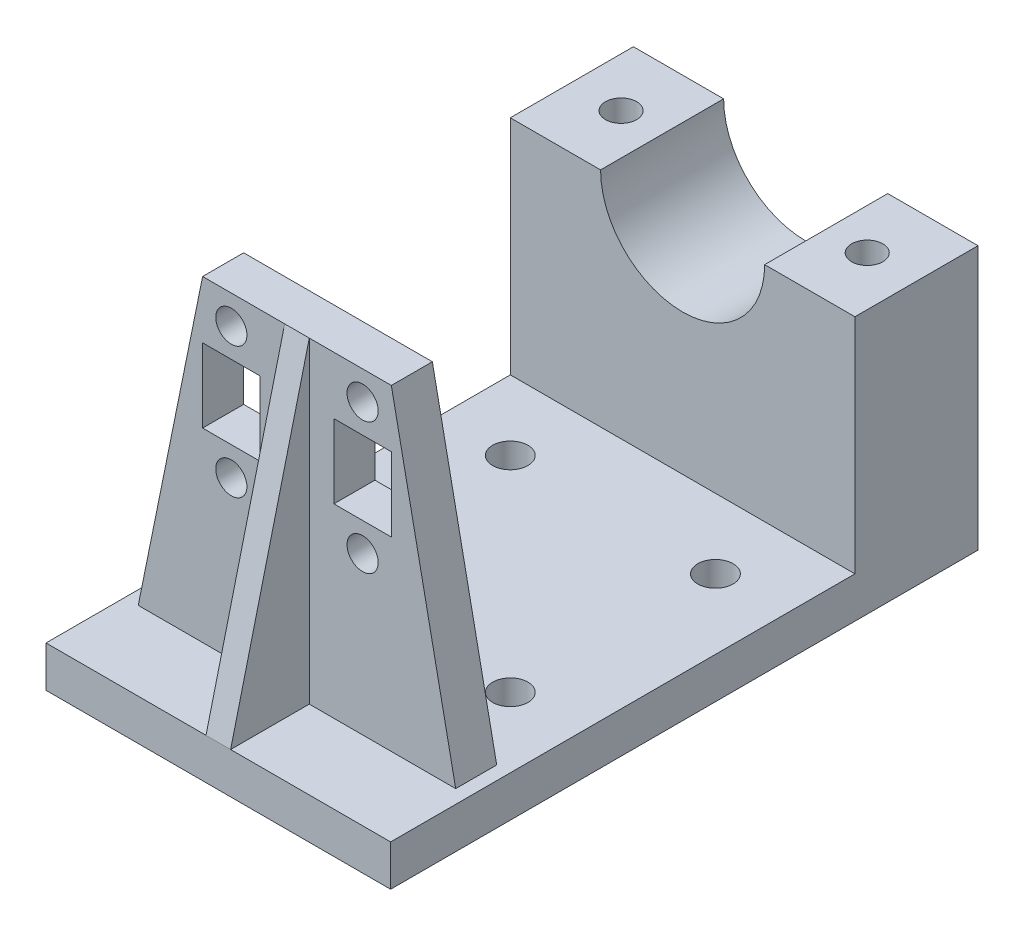
ISO-10303-21;
HEADER;
FILE_DESCRIPTION(('STEP AP214'),'2;1');
FILE_NAME('part.step','',(''),(''),'','','');
FILE_SCHEMA(('AUTOMOTIVE_DESIGN { 1 0 10303 214 1 1 1 1 }'));
ENDSEC;
DATA;
#1=APPLICATION_CONTEXT('core data for automotive mechanical design processes');
#2=APPLICATION_PROTOCOL_DEFINITION('international standard','automotive_design',2000,#1);
#3=PRODUCT_CONTEXT('',#1,'mechanical');
#4=PRODUCT('Part','Part','',(#3));
#5=PRODUCT_RELATED_PRODUCT_CATEGORY('part','',(#4));
#6=PRODUCT_DEFINITION_FORMATION('','',#4);
#7=PRODUCT_DEFINITION_CONTEXT('part definition',#1,'design');
#8=PRODUCT_DEFINITION('design','',#6,#7);
#9=PRODUCT_DEFINITION_SHAPE('','',#8);
#10=(LENGTH_UNIT() NAMED_UNIT(*) SI_UNIT(.MILLI.,.METRE.));
#11=(NAMED_UNIT(*) PLANE_ANGLE_UNIT() SI_UNIT($,.RADIAN.));
#12=(NAMED_UNIT(*) SI_UNIT($,.STERADIAN.) SOLID_ANGLE_UNIT());
#13=UNCERTAINTY_MEASURE_WITH_UNIT(LENGTH_MEASURE(1.E-05),#10,'distance_accuracy_value','');
#14=(GEOMETRIC_REPRESENTATION_CONTEXT(3) GLOBAL_UNCERTAINTY_ASSIGNED_CONTEXT((#13)) GLOBAL_UNIT_ASSIGNED_CONTEXT((#10,
#11,#12)) REPRESENTATION_CONTEXT('',''));
#15=CARTESIAN_POINT('',(0.,0.,0.));
#16=DIRECTION('',(0.,0.,1.));
#17=DIRECTION('',(1.,0.,0.));
#18=AXIS2_PLACEMENT_3D('',#15,#16,#17);
#19=CARTESIAN_POINT('',(-8.,-8.,54.5));
#20=DIRECTION('',(0.,0.,-1.));
#21=DIRECTION('',(-1.,0.,0.));
#22=AXIS2_PLACEMENT_3D('',#19,#20,#21);
#23=CYLINDRICAL_SURFACE('',#22,1.9);
#24=CARTESIAN_POINT('',(-8.,-8.,54.5));
#25=DIRECTION('',(0.,0.,1.));
#26=DIRECTION('',(1.,0.,0.));
#27=AXIS2_PLACEMENT_3D('',#24,#25,#26);
#28=CIRCLE('',#27,1.9);
#29=CARTESIAN_POINT('',(-6.1,-8.,54.5));
#30=VERTEX_POINT('',#29);
#31=EDGE_CURVE('E312',#30,#30,#28,.T.);
#32=ORIENTED_EDGE('',*,*,#31,.T.);
#33=EDGE_LOOP('',(#32));
#34=FACE_BOUND('',#33,.T.);
#35=CARTESIAN_POINT('',(-8.,-8.,49.5));
#36=DIRECTION('',(0.,0.,1.));
#37=DIRECTION('',(1.,0.,0.));
#38=AXIS2_PLACEMENT_3D('',#35,#36,#37);
#39=CIRCLE('',#38,1.9);
#40=CARTESIAN_POINT('',(-6.1,-8.,49.5));
#41=VERTEX_POINT('',#40);
#42=EDGE_CURVE('E316',#41,#41,#39,.T.);
#43=ORIENTED_EDGE('',*,*,#42,.F.);
#44=EDGE_LOOP('',(#43));
#45=FACE_BOUND('',#44,.T.);
#46=ADVANCED_FACE('F40',(#34,#45),#23,.F.);
#47=CARTESIAN_POINT('',(-8.,8.,54.5));
#48=DIRECTION('',(0.,0.,-1.));
#49=DIRECTION('',(-1.,0.,0.));
#50=AXIS2_PLACEMENT_3D('',#47,#48,#49);
#51=CYLINDRICAL_SURFACE('',#50,1.9);
#52=CARTESIAN_POINT('',(-8.,8.,54.5));
#53=DIRECTION('',(0.,0.,1.));
#54=DIRECTION('',(1.,0.,0.));
#55=AXIS2_PLACEMENT_3D('',#52,#53,#54);
#56=CIRCLE('',#55,1.9);
#57=CARTESIAN_POINT('',(-6.1,8.,54.5));
#58=VERTEX_POINT('',#57);
#59=EDGE_CURVE('E289',#58,#58,#56,.T.);
#60=ORIENTED_EDGE('',*,*,#59,.T.);
#61=EDGE_LOOP('',(#60));
#62=FACE_BOUND('',#61,.T.);
#63=CARTESIAN_POINT('',(-8.,8.,49.5));
#64=DIRECTION('',(0.,0.,1.));
#65=DIRECTION('',(1.,0.,0.));
#66=AXIS2_PLACEMENT_3D('',#63,#64,#65);
#67=CIRCLE('',#66,1.9);
#68=CARTESIAN_POINT('',(-6.1,8.,49.5));
#69=VERTEX_POINT('',#68);
#70=EDGE_CURVE('E300',#69,#69,#67,.T.);
#71=ORIENTED_EDGE('',*,*,#70,.F.);
#72=EDGE_LOOP('',(#71));
#73=FACE_BOUND('',#72,.T.);
#74=ADVANCED_FACE('F548',(#62,#73),#51,.F.);
#75=CARTESIAN_POINT('',(8.,8.,54.5));
#76=DIRECTION('',(0.,0.,-1.));
#77=DIRECTION('',(-1.,0.,0.));
#78=AXIS2_PLACEMENT_3D('',#75,#76,#77);
#79=CYLINDRICAL_SURFACE('',#78,1.9);
#80=CARTESIAN_POINT('',(8.,8.,54.5));
#81=DIRECTION('',(0.,0.,1.));
#82=DIRECTION('',(1.,0.,0.));
#83=AXIS2_PLACEMENT_3D('',#80,#81,#82);
#84=CIRCLE('',#83,1.9);
#85=CARTESIAN_POINT('',(9.9,8.,54.5));
#86=VERTEX_POINT('',#85);
#87=EDGE_CURVE('E304',#86,#86,#84,.T.);
#88=ORIENTED_EDGE('',*,*,#87,.T.);
#89=EDGE_LOOP('',(#88));
#90=FACE_BOUND('',#89,.T.);
#91=CARTESIAN_POINT('',(8.,8.,49.5));
#92=DIRECTION('',(0.,0.,1.));
#93=DIRECTION('',(1.,0.,0.));
#94=AXIS2_PLACEMENT_3D('',#91,#92,#93);
#95=CIRCLE('',#94,1.9);
#96=CARTESIAN_POINT('',(9.9,8.,49.5));
#97=VERTEX_POINT('',#96);
#98=EDGE_CURVE('E308',#97,#97,#95,.T.);
#99=ORIENTED_EDGE('',*,*,#98,.F.);
#100=EDGE_LOOP('',(#99));
#101=FACE_BOUND('',#100,.T.);
#102=ADVANCED_FACE('F554',(#90,#101),#79,.F.);
#103=CARTESIAN_POINT('',(8.,-8.,54.5));
#104=DIRECTION('',(0.,0.,-1.));
#105=DIRECTION('',(-1.,0.,0.));
#106=AXIS2_PLACEMENT_3D('',#103,#104,#105);
#107=CYLINDRICAL_SURFACE('',#106,1.9);
#108=CARTESIAN_POINT('',(8.,-8.,54.5));
#109=DIRECTION('',(0.,0.,1.));
#110=DIRECTION('',(1.,0.,0.));
#111=AXIS2_PLACEMENT_3D('',#108,#109,#110);
#112=CIRCLE('',#111,1.9);
#113=CARTESIAN_POINT('',(9.9,-8.,54.5));
#114=VERTEX_POINT('',#113);
#115=EDGE_CURVE('E320',#114,#114,#112,.T.);
#116=ORIENTED_EDGE('',*,*,#115,.T.);
#117=EDGE_LOOP('',(#116));
#118=FACE_BOUND('',#117,.T.);
#119=CARTESIAN_POINT('',(8.,-8.,49.5));
#120=DIRECTION('',(0.,0.,1.));
#121=DIRECTION('',(1.,0.,0.));
#122=AXIS2_PLACEMENT_3D('',#119,#120,#121);
#123=CIRCLE('',#122,1.9);
#124=CARTESIAN_POINT('',(9.9,-8.,49.5));
#125=VERTEX_POINT('',#124);
#126=EDGE_CURVE('E324',#125,#125,#123,.T.);
#127=ORIENTED_EDGE('',*,*,#126,.F.);
#128=EDGE_LOOP('',(#127));
#129=FACE_BOUND('',#128,.T.);
#130=ADVANCED_FACE('F560',(#118,#129),#107,.F.);
#131=CARTESIAN_POINT('',(-11.5,4.5,54.5));
#132=DIRECTION('',(1.,0.,0.));
#133=DIRECTION('',(0.,0.,-1.));
#134=AXIS2_PLACEMENT_3D('',#131,#132,#133);
#135=PLANE('',#134);
#136=DIRECTION('',(0.,-1.,0.));
#137=VECTOR('',#136,1.);
#138=CARTESIAN_POINT('',(-11.5,4.5,49.5));
#139=LINE('',#138,#137);
#140=CARTESIAN_POINT('',(-11.5,4.5,49.5));
#141=VERTEX_POINT('',#140);
#142=CARTESIAN_POINT('',(-11.5,-4.5,49.5));
#143=VERTEX_POINT('',#142);
#144=EDGE_CURVE('E351',#141,#143,#139,.T.);
#145=ORIENTED_EDGE('',*,*,#144,.F.);
#146=DIRECTION('',(0.,0.,-1.));
#147=VECTOR('',#146,1.);
#148=CARTESIAN_POINT('',(-11.5,4.5,54.5));
#149=LINE('',#148,#147);
#150=CARTESIAN_POINT('',(-11.5,4.5,54.5));
#151=VERTEX_POINT('',#150);
#152=EDGE_CURVE('E335',#151,#141,#149,.T.);
#153=ORIENTED_EDGE('',*,*,#152,.F.);
#154=DIRECTION('',(0.,-1.,0.));
#155=VECTOR('',#154,1.);
#156=CARTESIAN_POINT('',(-11.5,4.5,54.5));
#157=LINE('',#156,#155);
#158=CARTESIAN_POINT('',(-11.5,-4.5,54.5));
#159=VERTEX_POINT('',#158);
#160=EDGE_CURVE('E366',#151,#159,#157,.T.);
#161=ORIENTED_EDGE('',*,*,#160,.T.);
#162=DIRECTION('',(0.,0.,-1.));
#163=VECTOR('',#162,1.);
#164=CARTESIAN_POINT('',(-11.5,-4.5,54.5));
#165=LINE('',#164,#163);
#166=EDGE_CURVE('E338',#159,#143,#165,.T.);
#167=ORIENTED_EDGE('',*,*,#166,.T.);
#168=EDGE_LOOP('',(#145,#153,#161,#167));
#169=FACE_BOUND('',#168,.T.);
#170=ADVANCED_FACE('F636',(#169),#135,.T.);
#171=CARTESIAN_POINT('',(-11.5,4.5,54.5));
#172=DIRECTION('',(0.,-1.,0.));
#173=DIRECTION('',(0.,0.,-1.));
#174=AXIS2_PLACEMENT_3D('',#171,#172,#173);
#175=PLANE('',#174);
#176=DIRECTION('',(-1.,0.,0.));
#177=VECTOR('',#176,1.);
#178=CARTESIAN_POINT('',(-11.5,4.5,49.5));
#179=LINE('',#178,#177);
#180=CARTESIAN_POINT('',(-4.5,4.5,49.5));
#181=VERTEX_POINT('',#180);
#182=EDGE_CURVE('E355',#181,#141,#179,.T.);
#183=ORIENTED_EDGE('',*,*,#182,.F.);
#184=DIRECTION('',(0.,0.,-1.));
#185=VECTOR('',#184,1.);
#186=CARTESIAN_POINT('',(-4.5,4.5,54.5));
#187=LINE('',#186,#185);
#188=CARTESIAN_POINT('',(-4.5,4.5,54.5));
#189=VERTEX_POINT('',#188);
#190=EDGE_CURVE('E328',#189,#181,#187,.T.);
#191=ORIENTED_EDGE('',*,*,#190,.F.);
#192=DIRECTION('',(-1.,0.,0.));
#193=VECTOR('',#192,1.);
#194=CARTESIAN_POINT('',(-11.5,4.5,54.5));
#195=LINE('',#194,#193);
#196=EDGE_CURVE('E370',#189,#151,#195,.T.);
#197=ORIENTED_EDGE('',*,*,#196,.T.);
#198=ORIENTED_EDGE('',*,*,#152,.T.);
#199=EDGE_LOOP('',(#183,#191,#197,#198));
#200=FACE_BOUND('',#199,.T.);
#201=ADVANCED_FACE('F639',(#200),#175,.T.);
#202=CARTESIAN_POINT('',(-4.5,4.5,54.5));
#203=DIRECTION('',(-1.,0.,0.));
#204=DIRECTION('',(0.,0.,1.));
#205=AXIS2_PLACEMENT_3D('',#202,#203,#204);
#206=PLANE('',#205);
#207=DIRECTION('',(0.,1.,0.));
#208=VECTOR('',#207,1.);
#209=CARTESIAN_POINT('',(-4.5,4.5,49.5));
#210=LINE('',#209,#208);
#211=CARTESIAN_POINT('',(-4.5,-4.5,49.5));
#212=VERTEX_POINT('',#211);
#213=EDGE_CURVE('E359',#212,#181,#210,.T.);
#214=ORIENTED_EDGE('',*,*,#213,.F.);
#215=DIRECTION('',(0.,0.,-1.));
#216=VECTOR('',#215,1.);
#217=CARTESIAN_POINT('',(-4.5,-4.5,54.5));
#218=LINE('',#217,#216);
#219=CARTESIAN_POINT('',(-4.5,-4.5,54.5));
#220=VERTEX_POINT('',#219);
#221=EDGE_CURVE('E341',#220,#212,#218,.T.);
#222=ORIENTED_EDGE('',*,*,#221,.F.);
#223=DIRECTION('',(0.,1.,0.));
#224=VECTOR('',#223,1.);
#225=CARTESIAN_POINT('',(-4.5,4.5,54.5));
#226=LINE('',#225,#224);
#227=EDGE_CURVE('E350',#220,#189,#226,.T.);
#228=ORIENTED_EDGE('',*,*,#227,.T.);
#229=ORIENTED_EDGE('',*,*,#190,.T.);
#230=EDGE_LOOP('',(#214,#222,#228,#229));
#231=FACE_BOUND('',#230,.T.);
#232=ADVANCED_FACE('F634',(#231),#206,.T.);
#233=CARTESIAN_POINT('',(-11.5,-4.5,54.5));
#234=DIRECTION('',(0.,1.,0.));
#235=DIRECTION('',(0.,0.,1.));
#236=AXIS2_PLACEMENT_3D('',#233,#234,#235);
#237=PLANE('',#236);
#238=DIRECTION('',(1.,0.,0.));
#239=VECTOR('',#238,1.);
#240=CARTESIAN_POINT('',(-11.5,-4.5,49.5));
#241=LINE('',#240,#239);
#242=EDGE_CURVE('E346',#143,#212,#241,.T.);
#243=ORIENTED_EDGE('',*,*,#242,.F.);
#244=ORIENTED_EDGE('',*,*,#166,.F.);
#245=DIRECTION('',(1.,0.,0.));
#246=VECTOR('',#245,1.);
#247=CARTESIAN_POINT('',(-11.5,-4.5,54.5));
#248=LINE('',#247,#246);
#249=EDGE_CURVE('E345',#159,#220,#248,.T.);
#250=ORIENTED_EDGE('',*,*,#249,.T.);
#251=ORIENTED_EDGE('',*,*,#221,.T.);
#252=EDGE_LOOP('',(#243,#244,#250,#251));
#253=FACE_BOUND('',#252,.T.);
#254=ADVANCED_FACE('F624',(#253),#237,.T.);
#255=CARTESIAN_POINT('',(4.5,4.5,54.5));
#256=DIRECTION('',(1.,0.,0.));
#257=DIRECTION('',(0.,0.,-1.));
#258=AXIS2_PLACEMENT_3D('',#255,#256,#257);
#259=PLANE('',#258);
#260=DIRECTION('',(0.,-1.,0.));
#261=VECTOR('',#260,1.);
#262=CARTESIAN_POINT('',(4.5,4.5,49.5));
#263=LINE('',#262,#261);
#264=CARTESIAN_POINT('',(4.5,4.5,49.5));
#265=VERTEX_POINT('',#264);
#266=CARTESIAN_POINT('',(4.5,-4.5,49.5));
#267=VERTEX_POINT('',#266);
#268=EDGE_CURVE('E393',#265,#267,#263,.T.);
#269=ORIENTED_EDGE('',*,*,#268,.F.);
#270=DIRECTION('',(0.,0.,-1.));
#271=VECTOR('',#270,1.);
#272=CARTESIAN_POINT('',(4.5,4.5,54.5));
#273=LINE('',#272,#271);
#274=CARTESIAN_POINT('',(4.5,4.5,54.5));
#275=VERTEX_POINT('',#274);
#276=EDGE_CURVE('E378',#275,#265,#273,.T.);
#277=ORIENTED_EDGE('',*,*,#276,.F.);
#278=DIRECTION('',(0.,-1.,0.));
#279=VECTOR('',#278,1.);
#280=CARTESIAN_POINT('',(4.5,4.5,54.5));
#281=LINE('',#280,#279);
#282=CARTESIAN_POINT('',(4.5,-4.5,54.5));
#283=VERTEX_POINT('',#282);
#284=EDGE_CURVE('E408',#275,#283,#281,.T.);
#285=ORIENTED_EDGE('',*,*,#284,.T.);
#286=DIRECTION('',(0.,0.,-1.));
#287=VECTOR('',#286,1.);
#288=CARTESIAN_POINT('',(4.5,-4.5,54.5));
#289=LINE('',#288,#287);
#290=EDGE_CURVE('E66',#283,#267,#289,.T.);
#291=ORIENTED_EDGE('',*,*,#290,.T.);
#292=EDGE_LOOP('',(#269,#277,#285,#291));
#293=FACE_BOUND('',#292,.T.);
#294=ADVANCED_FACE('F620',(#293),#259,.T.);
#295=CARTESIAN_POINT('',(4.5,4.5,54.5));
#296=DIRECTION('',(0.,-1.,0.));
#297=DIRECTION('',(0.,0.,-1.));
#298=AXIS2_PLACEMENT_3D('',#295,#296,#297);
#299=PLANE('',#298);
#300=DIRECTION('',(-1.,0.,0.));
#301=VECTOR('',#300,1.);
#302=CARTESIAN_POINT('',(4.5,4.5,49.5));
#303=LINE('',#302,#301);
#304=CARTESIAN_POINT('',(11.5,4.5,49.5));
#305=VERTEX_POINT('',#304);
#306=EDGE_CURVE('E397',#305,#265,#303,.T.);
#307=ORIENTED_EDGE('',*,*,#306,.F.);
#308=DIRECTION('',(0.,0.,-1.));
#309=VECTOR('',#308,1.);
#310=CARTESIAN_POINT('',(11.5,4.5,54.5));
#311=LINE('',#310,#309);
#312=CARTESIAN_POINT('',(11.5,4.5,54.5));
#313=VERTEX_POINT('',#312);
#314=EDGE_CURVE('E363',#313,#305,#311,.T.);
#315=ORIENTED_EDGE('',*,*,#314,.F.);
#316=DIRECTION('',(-1.,0.,0.));
#317=VECTOR('',#316,1.);
#318=CARTESIAN_POINT('',(4.5,4.5,54.5));
#319=LINE('',#318,#317);
#320=EDGE_CURVE('E411',#313,#275,#319,.T.);
#321=ORIENTED_EDGE('',*,*,#320,.T.);
#322=ORIENTED_EDGE('',*,*,#276,.T.);
#323=EDGE_LOOP('',(#307,#315,#321,#322));
#324=FACE_BOUND('',#323,.T.);
#325=ADVANCED_FACE('F623',(#324),#299,.T.);
#326=CARTESIAN_POINT('',(11.5,4.5,54.5));
#327=DIRECTION('',(-1.,0.,0.));
#328=DIRECTION('',(0.,0.,1.));
#329=AXIS2_PLACEMENT_3D('',#326,#327,#328);
#330=PLANE('',#329);
#331=DIRECTION('',(0.,1.,0.));
#332=VECTOR('',#331,1.);
#333=CARTESIAN_POINT('',(11.5,4.5,49.5));
#334=LINE('',#333,#332);
#335=CARTESIAN_POINT('',(11.5,-4.5,49.5));
#336=VERTEX_POINT('',#335);
#337=EDGE_CURVE('E401',#336,#305,#334,.T.);
#338=ORIENTED_EDGE('',*,*,#337,.F.);
#339=DIRECTION('',(0.,0.,-1.));
#340=VECTOR('',#339,1.);
#341=CARTESIAN_POINT('',(11.5,-4.5,54.5));
#342=LINE('',#341,#340);
#343=CARTESIAN_POINT('',(11.5,-4.5,54.5));
#344=VERTEX_POINT('',#343);
#345=EDGE_CURVE('E383',#344,#336,#342,.T.);
#346=ORIENTED_EDGE('',*,*,#345,.F.);
#347=DIRECTION('',(0.,1.,0.));
#348=VECTOR('',#347,1.);
#349=CARTESIAN_POINT('',(11.5,4.5,54.5));
#350=LINE('',#349,#348);
#351=EDGE_CURVE('E392',#344,#313,#350,.T.);
#352=ORIENTED_EDGE('',*,*,#351,.T.);
#353=ORIENTED_EDGE('',*,*,#314,.T.);
#354=EDGE_LOOP('',(#338,#346,#352,#353));
#355=FACE_BOUND('',#354,.T.);
#356=ADVANCED_FACE('F584',(#355),#330,.T.);
#357=CARTESIAN_POINT('',(4.5,-4.5,54.5));
#358=DIRECTION('',(0.,1.,0.));
#359=DIRECTION('',(0.,0.,1.));
#360=AXIS2_PLACEMENT_3D('',#357,#358,#359);
#361=PLANE('',#360);
#362=DIRECTION('',(1.,0.,0.));
#363=VECTOR('',#362,1.);
#364=CARTESIAN_POINT('',(4.5,-4.5,49.5));
#365=LINE('',#364,#363);
#366=EDGE_CURVE('E388',#267,#336,#365,.T.);
#367=ORIENTED_EDGE('',*,*,#366,.F.);
#368=ORIENTED_EDGE('',*,*,#290,.F.);
#369=DIRECTION('',(1.,0.,0.));
#370=VECTOR('',#369,1.);
#371=CARTESIAN_POINT('',(4.5,-4.5,54.5));
#372=LINE('',#371,#370);
#373=EDGE_CURVE('E387',#283,#344,#372,.T.);
#374=ORIENTED_EDGE('',*,*,#373,.T.);
#375=ORIENTED_EDGE('',*,*,#345,.T.);
#376=EDGE_LOOP('',(#367,#368,#374,#375));
#377=FACE_BOUND('',#376,.T.);
#378=ADVANCED_FACE('F579',(#377),#361,.T.);
#379=CARTESIAN_POINT('',(-11.5,11.5,54.5));
#380=DIRECTION('',(0.,-1.,0.));
#381=DIRECTION('',(0.,0.,-1.));
#382=AXIS2_PLACEMENT_3D('',#379,#380,#381);
#383=PLANE('',#382);
#384=DIRECTION('',(-1.,0.,0.));
#385=VECTOR('',#384,1.);
#386=CARTESIAN_POINT('',(-11.5,11.5,49.5));
#387=LINE('',#386,#385);
#388=CARTESIAN_POINT('',(11.5,11.5,49.5));
#389=VERTEX_POINT('',#388);
#390=CARTESIAN_POINT('',(-11.5,11.5,49.5));
#391=VERTEX_POINT('',#390);
#392=EDGE_CURVE('E283',#389,#391,#387,.T.);
#393=ORIENTED_EDGE('',*,*,#392,.T.);
#394=DIRECTION('',(0.,0.,-1.));
#395=VECTOR('',#394,1.);
#396=CARTESIAN_POINT('',(-11.5,11.5,54.5));
#397=LINE('',#396,#395);
#398=CARTESIAN_POINT('',(-11.5,11.5,54.5));
#399=VERTEX_POINT('',#398);
#400=EDGE_CURVE('E273',#399,#391,#397,.T.);
#401=ORIENTED_EDGE('',*,*,#400,.F.);
#402=DIRECTION('',(-1.,0.,0.));
#403=VECTOR('',#402,1.);
#404=CARTESIAN_POINT('',(-11.5,11.5,54.5));
#405=LINE('',#404,#403);
#406=CARTESIAN_POINT('',(-1.5,11.5,54.5));
#407=VERTEX_POINT('',#406);
#408=EDGE_CURVE('E297',#407,#399,#405,.T.);
#409=ORIENTED_EDGE('',*,*,#408,.F.);
#410=DIRECTION('',(-1.,0.,0.));
#411=VECTOR('',#410,1.);
#412=CARTESIAN_POINT('',(1.5,11.5,54.5));
#413=LINE('',#412,#411);
#414=CARTESIAN_POINT('',(1.5,11.5,54.5));
#415=VERTEX_POINT('',#414);
#416=EDGE_CURVE('E405',#415,#407,#413,.T.);
#417=ORIENTED_EDGE('',*,*,#416,.F.);
#418=CARTESIAN_POINT('',(11.5,11.5,54.5));
#419=VERTEX_POINT('',#418);
#420=EDGE_CURVE('E293',#419,#415,#405,.T.);
#421=ORIENTED_EDGE('',*,*,#420,.F.);
#422=DIRECTION('',(0.,0.,-1.));
#423=VECTOR('',#422,1.);
#424=CARTESIAN_POINT('',(11.5,11.5,54.5));
#425=LINE('',#424,#423);
#426=EDGE_CURVE('E50',#419,#389,#425,.T.);
#427=ORIENTED_EDGE('',*,*,#426,.T.);
#428=EDGE_LOOP('',(#393,#401,#409,#417,#421,#427));
#429=FACE_BOUND('',#428,.T.);
#430=ADVANCED_FACE('F576',(#429),#383,.F.);
#431=CARTESIAN_POINT('',(-25.,-55.,54.5));
#432=DIRECTION('',(0.980009772999375,-0.198949352413407,0.));
#433=DIRECTION('',(0.198949352413407,0.980009772999375,0.));
#434=AXIS2_PLACEMENT_3D('',#431,#432,#433);
#435=PLANE('',#434);
#436=DIRECTION('',(0.,0.,-1.));
#437=VECTOR('',#436,1.);
#438=CARTESIAN_POINT('',(-19.3434590944451,-27.1362985022665,54.5));
#439=LINE('',#438,#437);
#440=CARTESIAN_POINT('',(-19.3434590944451,-27.1362985022665,54.5));
#441=VERTEX_POINT('',#440);
#442=CARTESIAN_POINT('',(-19.3434590944451,-27.1362985022665,49.5));
#443=VERTEX_POINT('',#442);
#444=EDGE_CURVE('E443',#441,#443,#439,.T.);
#445=ORIENTED_EDGE('',*,*,#444,.F.);
#446=DIRECTION('',(-0.198949352413407,-0.980009772999375,0.));
#447=VECTOR('',#446,1.);
#448=CARTESIAN_POINT('',(-25.,-55.,54.5));
#449=LINE('',#448,#447);
#450=EDGE_CURVE('E277',#399,#441,#449,.T.);
#451=ORIENTED_EDGE('',*,*,#450,.F.);
#452=ORIENTED_EDGE('',*,*,#400,.T.);
#453=DIRECTION('',(-0.198949352413407,-0.980009772999375,0.));
#454=VECTOR('',#453,1.);
#455=CARTESIAN_POINT('',(-25.,-55.,49.5));
#456=LINE('',#455,#454);
#457=EDGE_CURVE('E278',#391,#443,#456,.T.);
#458=ORIENTED_EDGE('',*,*,#457,.T.);
#459=EDGE_LOOP('',(#445,#451,#452,#458));
#460=FACE_BOUND('',#459,.T.);
#461=ADVANCED_FACE('F574',(#460),#435,.F.);
#462=CARTESIAN_POINT('',(25.,-55.,54.5));
#463=DIRECTION('',(-0.980009772999375,-0.198949352413407,0.));
#464=DIRECTION('',(0.198949352413407,-0.980009772999375,0.));
#465=AXIS2_PLACEMENT_3D('',#462,#463,#464);
#466=PLANE('',#465);
#467=DIRECTION('',(0.,0.,1.));
#468=VECTOR('',#467,1.);
#469=CARTESIAN_POINT('',(19.3434590944451,-27.1362985022665,54.5));
#470=LINE('',#469,#468);
#471=CARTESIAN_POINT('',(19.3434590944451,-27.1362985022665,49.5));
#472=VERTEX_POINT('',#471);
#473=CARTESIAN_POINT('',(19.3434590944451,-27.1362985022665,54.5));
#474=VERTEX_POINT('',#473);
#475=EDGE_CURVE('E428',#472,#474,#470,.T.);
#476=ORIENTED_EDGE('',*,*,#475,.F.);
#477=DIRECTION('',(-0.198949352413407,0.980009772999375,0.));
#478=VECTOR('',#477,1.);
#479=CARTESIAN_POINT('',(25.,-55.,49.5));
#480=LINE('',#479,#478);
#481=EDGE_CURVE('E286',#472,#389,#480,.T.);
#482=ORIENTED_EDGE('',*,*,#481,.T.);
#483=ORIENTED_EDGE('',*,*,#426,.F.);
#484=DIRECTION('',(-0.198949352413407,0.980009772999375,0.));
#485=VECTOR('',#484,1.);
#486=CARTESIAN_POINT('',(25.,-55.,54.5));
#487=LINE('',#486,#485);
#488=EDGE_CURVE('E282',#474,#419,#487,.T.);
#489=ORIENTED_EDGE('',*,*,#488,.F.);
#490=EDGE_LOOP('',(#476,#482,#483,#489));
#491=FACE_BOUND('',#490,.T.);
#492=ADVANCED_FACE('F42',(#491),#466,.F.);
#493=CARTESIAN_POINT('',(0.,0.,49.5));
#494=DIRECTION('',(0.,0.,-1.));
#495=DIRECTION('',(-1.,0.,0.));
#496=AXIS2_PLACEMENT_3D('',#493,#494,#495);
#497=PLANE('',#496);
#498=ORIENTED_EDGE('',*,*,#366,.T.);
#499=ORIENTED_EDGE('',*,*,#337,.T.);
#500=ORIENTED_EDGE('',*,*,#306,.T.);
#501=ORIENTED_EDGE('',*,*,#268,.T.);
#502=EDGE_LOOP('',(#498,#499,#500,#501));
#503=FACE_BOUND('',#502,.T.);
#504=ORIENTED_EDGE('',*,*,#242,.T.);
#505=ORIENTED_EDGE('',*,*,#213,.T.);
#506=ORIENTED_EDGE('',*,*,#182,.T.);
#507=ORIENTED_EDGE('',*,*,#144,.T.);
#508=EDGE_LOOP('',(#504,#505,#506,#507));
#509=FACE_BOUND('',#508,.T.);
#510=ORIENTED_EDGE('',*,*,#126,.T.);
#511=EDGE_LOOP('',(#510));
#512=FACE_BOUND('',#511,.T.);
#513=ORIENTED_EDGE('',*,*,#98,.T.);
#514=EDGE_LOOP('',(#513));
#515=FACE_BOUND('',#514,.T.);
#516=ORIENTED_EDGE('',*,*,#70,.T.);
#517=EDGE_LOOP('',(#516));
#518=FACE_BOUND('',#517,.T.);
#519=ORIENTED_EDGE('',*,*,#42,.T.);
#520=EDGE_LOOP('',(#519));
#521=FACE_BOUND('',#520,.T.);
#522=ORIENTED_EDGE('',*,*,#481,.F.);
#523=DIRECTION('',(-1.,0.,0.));
#524=VECTOR('',#523,1.);
#525=CARTESIAN_POINT('',(0.,-27.1362985022665,49.5));
#526=LINE('',#525,#524);
#527=EDGE_CURVE('E439',#472,#443,#526,.T.);
#528=ORIENTED_EDGE('',*,*,#527,.T.);
#529=ORIENTED_EDGE('',*,*,#457,.F.);
#530=ORIENTED_EDGE('',*,*,#392,.F.);
#531=EDGE_LOOP('',(#522,#528,#529,#530));
#532=FACE_BOUND('',#531,.T.);
#533=ADVANCED_FACE('F569',(#503,#509,#512,#515,#518,#521,#532),#497,.T.);
#534=CARTESIAN_POINT('',(-1.5,0.,0.));
#535=DIRECTION('',(-1.,0.,0.));
#536=DIRECTION('',(0.,0.,1.));
#537=AXIS2_PLACEMENT_3D('',#534,#535,#536);
#538=PLANE('',#537);
#539=DIRECTION('',(0.,1.,0.));
#540=VECTOR('',#539,1.);
#541=CARTESIAN_POINT('',(-1.5,-55.,54.5));
#542=LINE('',#541,#540);
#543=CARTESIAN_POINT('',(-1.5,-27.1362985022665,54.5));
#544=VERTEX_POINT('',#543);
#545=EDGE_CURVE('E425',#544,#407,#542,.T.);
#546=ORIENTED_EDGE('',*,*,#545,.F.);
#547=DIRECTION('',(0.,0.,1.));
#548=VECTOR('',#547,1.);
#549=CARTESIAN_POINT('',(-1.5,-27.1362985022665,0.));
#550=LINE('',#549,#548);
#551=CARTESIAN_POINT('',(-1.50000000000001,-27.1362985022665,64.0864500043217));
#552=VERTEX_POINT('',#551);
#553=EDGE_CURVE('E11',#544,#552,#550,.T.);
#554=ORIENTED_EDGE('',*,*,#553,.T.);
#555=DIRECTION('',(0.,-0.970570246541768,0.240818181472769));
#556=VECTOR('',#555,1.);
#557=CARTESIAN_POINT('',(-1.5,11.5,54.5));
#558=LINE('',#557,#556);
#559=EDGE_CURVE('E420',#407,#552,#558,.T.);
#560=ORIENTED_EDGE('',*,*,#559,.F.);
#561=EDGE_LOOP('',(#546,#554,#560));
#562=FACE_BOUND('',#561,.T.);
#563=ADVANCED_FACE('F572',(#562),#538,.T.);
#564=CARTESIAN_POINT('',(1.5,0.,0.));
#565=DIRECTION('',(-1.,0.,0.));
#566=DIRECTION('',(0.,0.,1.));
#567=AXIS2_PLACEMENT_3D('',#564,#565,#566);
#568=PLANE('',#567);
#569=DIRECTION('',(0.,0.,1.));
#570=VECTOR('',#569,1.);
#571=CARTESIAN_POINT('',(1.5,-27.1362985022665,0.));
#572=LINE('',#571,#570);
#573=CARTESIAN_POINT('',(1.5,-27.1362985022665,54.5));
#574=VERTEX_POINT('',#573);
#575=CARTESIAN_POINT('',(1.49999999999999,-27.1362985022665,64.0864500043217));
#576=VERTEX_POINT('',#575);
#577=EDGE_CURVE('E446',#574,#576,#572,.T.);
#578=ORIENTED_EDGE('',*,*,#577,.F.);
#579=DIRECTION('',(0.,1.,0.));
#580=VECTOR('',#579,1.);
#581=CARTESIAN_POINT('',(1.5,-55.,54.5));
#582=LINE('',#581,#580);
#583=EDGE_CURVE('E424',#574,#415,#582,.T.);
#584=ORIENTED_EDGE('',*,*,#583,.T.);
#585=DIRECTION('',(0.,-0.970570246541768,0.240818181472769));
#586=VECTOR('',#585,1.);
#587=CARTESIAN_POINT('',(1.5,11.5,54.5));
#588=LINE('',#587,#586);
#589=EDGE_CURVE('E419',#415,#576,#588,.T.);
#590=ORIENTED_EDGE('',*,*,#589,.T.);
#591=EDGE_LOOP('',(#578,#584,#590));
#592=FACE_BOUND('',#591,.T.);
#593=ADVANCED_FACE('F609',(#592),#568,.F.);
#594=CARTESIAN_POINT('',(1.5,11.5,54.5));
#595=DIRECTION('',(0.,-0.240818181472769,-0.970570246541768));
#596=DIRECTION('',(0.,0.970570246541768,-0.240818181472769));
#597=AXIS2_PLACEMENT_3D('',#594,#595,#596);
#598=PLANE('',#597);
#599=DIRECTION('',(-1.,0.,0.));
#600=VECTOR('',#599,1.);
#601=CARTESIAN_POINT('',(1.5,-27.1362985022665,64.0864500043217));
#602=LINE('',#601,#600);
#603=EDGE_CURVE('E452',#576,#552,#602,.T.);
#604=ORIENTED_EDGE('',*,*,#603,.F.);
#605=ORIENTED_EDGE('',*,*,#589,.F.);
#606=ORIENTED_EDGE('',*,*,#416,.T.);
#607=ORIENTED_EDGE('',*,*,#559,.T.);
#608=EDGE_LOOP('',(#604,#605,#606,#607));
#609=FACE_BOUND('',#608,.T.);
#610=ADVANCED_FACE('F605',(#609),#598,.F.);
#611=CARTESIAN_POINT('',(0.,0.,54.5));
#612=DIRECTION('',(0.,0.,-1.));
#613=DIRECTION('',(-1.,0.,0.));
#614=AXIS2_PLACEMENT_3D('',#611,#612,#613);
#615=PLANE('',#614);
#616=ORIENTED_EDGE('',*,*,#227,.F.);
#617=ORIENTED_EDGE('',*,*,#249,.F.);
#618=ORIENTED_EDGE('',*,*,#160,.F.);
#619=ORIENTED_EDGE('',*,*,#196,.F.);
#620=EDGE_LOOP('',(#616,#617,#618,#619));
#621=FACE_BOUND('',#620,.T.);
#622=ORIENTED_EDGE('',*,*,#59,.F.);
#623=EDGE_LOOP('',(#622));
#624=FACE_BOUND('',#623,.T.);
#625=ORIENTED_EDGE('',*,*,#31,.F.);
#626=EDGE_LOOP('',(#625));
#627=FACE_BOUND('',#626,.T.);
#628=DIRECTION('',(-1.,0.,0.));
#629=VECTOR('',#628,1.);
#630=CARTESIAN_POINT('',(0.,-27.1362985022665,54.5));
#631=LINE('',#630,#629);
#632=EDGE_CURVE('E449',#544,#441,#631,.T.);
#633=ORIENTED_EDGE('',*,*,#632,.F.);
#634=ORIENTED_EDGE('',*,*,#545,.T.);
#635=ORIENTED_EDGE('',*,*,#408,.T.);
#636=ORIENTED_EDGE('',*,*,#450,.T.);
#637=EDGE_LOOP('',(#633,#634,#635,#636));
#638=FACE_BOUND('',#637,.T.);
#639=ADVANCED_FACE('F567',(#621,#624,#627,#638),#615,.F.);
#640=ORIENTED_EDGE('',*,*,#87,.F.);
#641=EDGE_LOOP('',(#640));
#642=FACE_BOUND('',#641,.T.);
#643=ORIENTED_EDGE('',*,*,#115,.F.);
#644=EDGE_LOOP('',(#643));
#645=FACE_BOUND('',#644,.T.);
#646=ORIENTED_EDGE('',*,*,#351,.F.);
#647=ORIENTED_EDGE('',*,*,#373,.F.);
#648=ORIENTED_EDGE('',*,*,#284,.F.);
#649=ORIENTED_EDGE('',*,*,#320,.F.);
#650=EDGE_LOOP('',(#646,#647,#648,#649));
#651=FACE_BOUND('',#650,.T.);
#652=DIRECTION('',(-1.,0.,0.));
#653=VECTOR('',#652,1.);
#654=CARTESIAN_POINT('',(0.,-27.1362985022665,54.5));
#655=LINE('',#654,#653);
#656=EDGE_CURVE('E436',#474,#574,#655,.T.);
#657=ORIENTED_EDGE('',*,*,#656,.F.);
#658=ORIENTED_EDGE('',*,*,#488,.T.);
#659=ORIENTED_EDGE('',*,*,#420,.T.);
#660=ORIENTED_EDGE('',*,*,#583,.F.);
#661=EDGE_LOOP('',(#657,#658,#659,#660));
#662=FACE_BOUND('',#661,.T.);
#663=ADVANCED_FACE('F545',(#642,#645,#651,#662),#615,.F.);
#664=CARTESIAN_POINT('',(-21.,-32.1362985022665,-7.50000000000001));
#665=DIRECTION('',(1.,0.,0.));
#666=DIRECTION('',(0.,0.,-1.));
#667=AXIS2_PLACEMENT_3D('',#664,#665,#666);
#668=PLANE('',#667);
#669=DIRECTION('',(0.,0.,-1.));
#670=VECTOR('',#669,1.);
#671=CARTESIAN_POINT('',(-21.,-27.1362985022665,-7.50000000000001));
#672=LINE('',#671,#670);
#673=CARTESIAN_POINT('',(-21.,-27.1362985022665,64.0864500043217));
#674=VERTEX_POINT('',#673);
#675=CARTESIAN_POINT('',(-21.,-27.1362985022665,7.50000000000001));
#676=VERTEX_POINT('',#675);
#677=EDGE_CURVE('E209',#674,#676,#672,.T.);
#678=ORIENTED_EDGE('',*,*,#677,.T.);
#679=DIRECTION('',(0.,-1.,0.));
#680=VECTOR('',#679,1.);
#681=CARTESIAN_POINT('',(-21.,0.,7.5));
#682=LINE('',#681,#680);
#683=CARTESIAN_POINT('',(-21.,0.,7.5));
#684=VERTEX_POINT('',#683);
#685=EDGE_CURVE('E231',#684,#676,#682,.T.);
#686=ORIENTED_EDGE('',*,*,#685,.F.);
#687=DIRECTION('',(0.,0.,-1.));
#688=VECTOR('',#687,1.);
#689=CARTESIAN_POINT('',(-21.,0.,7.5));
#690=LINE('',#689,#688);
#691=CARTESIAN_POINT('',(-21.,0.,-7.5));
#692=VERTEX_POINT('',#691);
#693=EDGE_CURVE('E210',#684,#692,#690,.T.);
#694=ORIENTED_EDGE('',*,*,#693,.T.);
#695=DIRECTION('',(0.,1.,0.));
#696=VECTOR('',#695,1.);
#697=CARTESIAN_POINT('',(-21.,-32.1362985022665,-7.50000000000001));
#698=LINE('',#697,#696);
#699=CARTESIAN_POINT('',(-21.,-32.1362985022665,-7.50000000000001));
#700=VERTEX_POINT('',#699);
#701=EDGE_CURVE('E456',#700,#692,#698,.T.);
#702=ORIENTED_EDGE('',*,*,#701,.F.);
#703=DIRECTION('',(0.,0.,-1.));
#704=VECTOR('',#703,1.);
#705=CARTESIAN_POINT('',(-21.,-32.1362985022665,-7.50000000000001));
#706=LINE('',#705,#704);
#707=CARTESIAN_POINT('',(-21.,-32.1362985022665,64.0864500043217));
#708=VERTEX_POINT('',#707);
#709=EDGE_CURVE('E474',#708,#700,#706,.T.);
#710=ORIENTED_EDGE('',*,*,#709,.F.);
#711=DIRECTION('',(0.,1.,0.));
#712=VECTOR('',#711,1.);
#713=CARTESIAN_POINT('',(-21.,-32.1362985022665,64.0864500043217));
#714=LINE('',#713,#712);
#715=EDGE_CURVE('E465',#708,#674,#714,.T.);
#716=ORIENTED_EDGE('',*,*,#715,.T.);
#717=EDGE_LOOP('',(#678,#686,#694,#702,#710,#716));
#718=FACE_BOUND('',#717,.T.);
#719=ADVANCED_FACE('F523',(#718),#668,.F.);
#720=CARTESIAN_POINT('',(-21.,-32.1362985022665,-7.50000000000001));
#721=DIRECTION('',(0.,0.,1.));
#722=DIRECTION('',(1.,0.,0.));
#723=AXIS2_PLACEMENT_3D('',#720,#721,#722);
#724=PLANE('',#723);
#725=ORIENTED_EDGE('',*,*,#701,.T.);
#726=DIRECTION('',(-1.,0.,0.));
#727=VECTOR('',#726,1.);
#728=CARTESIAN_POINT('',(0.,0.,-7.5));
#729=LINE('',#728,#727);
#730=CARTESIAN_POINT('',(-10.,0.,-7.5));
#731=VERTEX_POINT('',#730);
#732=EDGE_CURVE('E237',#731,#692,#729,.T.);
#733=ORIENTED_EDGE('',*,*,#732,.F.);
#734=CARTESIAN_POINT('',(0.,0.,-7.5));
#735=DIRECTION('',(0.,0.,1.));
#736=DIRECTION('',(1.,0.,0.));
#737=AXIS2_PLACEMENT_3D('',#734,#735,#736);
#738=CIRCLE('',#737,10.);
#739=CARTESIAN_POINT('',(10.,0.,-7.5));
#740=VERTEX_POINT('',#739);
#741=EDGE_CURVE('E244',#731,#740,#738,.T.);
#742=ORIENTED_EDGE('',*,*,#741,.T.);
#743=CARTESIAN_POINT('',(21.,0.,-7.5));
#744=VERTEX_POINT('',#743);
#745=EDGE_CURVE('E232',#744,#740,#729,.T.);
#746=ORIENTED_EDGE('',*,*,#745,.F.);
#747=DIRECTION('',(0.,1.,0.));
#748=VECTOR('',#747,1.);
#749=CARTESIAN_POINT('',(21.,-32.1362985022665,-7.50000000000001));
#750=LINE('',#749,#748);
#751=CARTESIAN_POINT('',(21.,-32.1362985022665,-7.50000000000001));
#752=VERTEX_POINT('',#751);
#753=EDGE_CURVE('E204',#752,#744,#750,.T.);
#754=ORIENTED_EDGE('',*,*,#753,.F.);
#755=DIRECTION('',(1.,0.,0.));
#756=VECTOR('',#755,1.);
#757=CARTESIAN_POINT('',(-21.,-32.1362985022665,-7.50000000000001));
#758=LINE('',#757,#756);
#759=EDGE_CURVE('E487',#700,#752,#758,.T.);
#760=ORIENTED_EDGE('',*,*,#759,.F.);
#761=EDGE_LOOP('',(#725,#733,#742,#746,#754,#760));
#762=FACE_BOUND('',#761,.T.);
#763=ADVANCED_FACE('F537',(#762),#724,.F.);
#764=CARTESIAN_POINT('',(21.,-32.1362985022665,-7.50000000000001));
#765=DIRECTION('',(-1.,0.,0.));
#766=DIRECTION('',(0.,0.,1.));
#767=AXIS2_PLACEMENT_3D('',#764,#765,#766);
#768=PLANE('',#767);
#769=ORIENTED_EDGE('',*,*,#753,.T.);
#770=DIRECTION('',(0.,0.,1.));
#771=VECTOR('',#770,1.);
#772=CARTESIAN_POINT('',(21.,0.,7.5));
#773=LINE('',#772,#771);
#774=CARTESIAN_POINT('',(21.,0.,7.5));
#775=VERTEX_POINT('',#774);
#776=EDGE_CURVE('E198',#744,#775,#773,.T.);
#777=ORIENTED_EDGE('',*,*,#776,.T.);
#778=DIRECTION('',(0.,1.,0.));
#779=VECTOR('',#778,1.);
#780=CARTESIAN_POINT('',(21.,0.,7.5));
#781=LINE('',#780,#779);
#782=CARTESIAN_POINT('',(21.,-27.1362985022665,7.50000000000001));
#783=VERTEX_POINT('',#782);
#784=EDGE_CURVE('E200',#783,#775,#781,.T.);
#785=ORIENTED_EDGE('',*,*,#784,.F.);
#786=DIRECTION('',(0.,0.,1.));
#787=VECTOR('',#786,1.);
#788=CARTESIAN_POINT('',(21.,-27.1362985022665,-7.50000000000001));
#789=LINE('',#788,#787);
#790=CARTESIAN_POINT('',(21.,-27.1362985022665,64.0864500043217));
#791=VERTEX_POINT('',#790);
#792=EDGE_CURVE('E476',#783,#791,#789,.T.);
#793=ORIENTED_EDGE('',*,*,#792,.T.);
#794=DIRECTION('',(0.,1.,0.));
#795=VECTOR('',#794,1.);
#796=CARTESIAN_POINT('',(21.,-32.1362985022665,64.0864500043217));
#797=LINE('',#796,#795);
#798=CARTESIAN_POINT('',(21.,-32.1362985022665,64.0864500043217));
#799=VERTEX_POINT('',#798);
#800=EDGE_CURVE('E461',#799,#791,#797,.T.);
#801=ORIENTED_EDGE('',*,*,#800,.F.);
#802=DIRECTION('',(0.,0.,1.));
#803=VECTOR('',#802,1.);
#804=CARTESIAN_POINT('',(21.,-32.1362985022665,-7.50000000000001));
#805=LINE('',#804,#803);
#806=EDGE_CURVE('E484',#752,#799,#805,.T.);
#807=ORIENTED_EDGE('',*,*,#806,.F.);
#808=EDGE_LOOP('',(#769,#777,#785,#793,#801,#807));
#809=FACE_BOUND('',#808,.T.);
#810=ADVANCED_FACE('F199',(#809),#768,.F.);
#811=CARTESIAN_POINT('',(-21.,-32.1362985022665,64.0864500043217));
#812=DIRECTION('',(0.,0.,-1.));
#813=DIRECTION('',(-1.,0.,0.));
#814=AXIS2_PLACEMENT_3D('',#811,#812,#813);
#815=PLANE('',#814);
#816=DIRECTION('',(-1.,0.,0.));
#817=VECTOR('',#816,1.);
#818=CARTESIAN_POINT('',(-21.,-27.1362985022665,64.0864500043217));
#819=LINE('',#818,#817);
#820=EDGE_CURVE('E470',#791,#576,#819,.T.);
#821=ORIENTED_EDGE('',*,*,#820,.T.);
#822=ORIENTED_EDGE('',*,*,#603,.T.);
#823=EDGE_CURVE('E475',#552,#674,#819,.T.);
#824=ORIENTED_EDGE('',*,*,#823,.T.);
#825=ORIENTED_EDGE('',*,*,#715,.F.);
#826=DIRECTION('',(-1.,0.,0.));
#827=VECTOR('',#826,1.);
#828=CARTESIAN_POINT('',(-21.,-32.1362985022665,64.0864500043217));
#829=LINE('',#828,#827);
#830=EDGE_CURVE('E469',#799,#708,#829,.T.);
#831=ORIENTED_EDGE('',*,*,#830,.F.);
#832=ORIENTED_EDGE('',*,*,#800,.T.);
#833=EDGE_LOOP('',(#821,#822,#824,#825,#831,#832));
#834=FACE_BOUND('',#833,.T.);
#835=ADVANCED_FACE('F532',(#834),#815,.F.);
#836=CARTESIAN_POINT('',(0.,-32.1362985022665,0.));
#837=DIRECTION('',(0.,1.,0.));
#838=DIRECTION('',(0.,0.,1.));
#839=AXIS2_PLACEMENT_3D('',#836,#837,#838);
#840=PLANE('',#839);
#841=CARTESIAN_POINT('',(12.5,-32.1362985022665,41.));
#842=DIRECTION('',(0.,1.,0.));
#843=DIRECTION('',(0.,0.,1.));
#844=AXIS2_PLACEMENT_3D('',#841,#842,#843);
#845=CIRCLE('',#844,2.15);
#846=CARTESIAN_POINT('',(12.5,-32.1362985022665,43.15));
#847=VERTEX_POINT('',#846);
#848=EDGE_CURVE('E840',#847,#847,#845,.T.);
#849=ORIENTED_EDGE('',*,*,#848,.T.);
#850=EDGE_LOOP('',(#849));
#851=FACE_BOUND('',#850,.T.);
#852=CARTESIAN_POINT('',(-12.5,-32.1362985022665,41.));
#853=DIRECTION('',(0.,1.,0.));
#854=DIRECTION('',(0.,0.,1.));
#855=AXIS2_PLACEMENT_3D('',#852,#853,#854);
#856=CIRCLE('',#855,2.15);
#857=CARTESIAN_POINT('',(-12.5,-32.1362985022665,43.15));
#858=VERTEX_POINT('',#857);
#859=EDGE_CURVE('E842',#858,#858,#856,.T.);
#860=ORIENTED_EDGE('',*,*,#859,.T.);
#861=EDGE_LOOP('',(#860));
#862=FACE_BOUND('',#861,.T.);
#863=CARTESIAN_POINT('',(-12.5,-32.1362985022665,16.));
#864=DIRECTION('',(0.,1.,0.));
#865=DIRECTION('',(0.,0.,1.));
#866=AXIS2_PLACEMENT_3D('',#863,#864,#865);
#867=CIRCLE('',#866,2.15);
#868=CARTESIAN_POINT('',(-12.5,-32.1362985022665,18.15));
#869=VERTEX_POINT('',#868);
#870=EDGE_CURVE('E846',#869,#869,#867,.T.);
#871=ORIENTED_EDGE('',*,*,#870,.T.);
#872=EDGE_LOOP('',(#871));
#873=FACE_BOUND('',#872,.T.);
#874=CARTESIAN_POINT('',(12.5,-32.1362985022665,16.));
#875=DIRECTION('',(0.,1.,0.));
#876=DIRECTION('',(0.,0.,1.));
#877=AXIS2_PLACEMENT_3D('',#874,#875,#876);
#878=CIRCLE('',#877,2.15);
#879=CARTESIAN_POINT('',(12.5,-32.1362985022665,18.15));
#880=VERTEX_POINT('',#879);
#881=EDGE_CURVE('E268',#880,#880,#878,.T.);
#882=ORIENTED_EDGE('',*,*,#881,.T.);
#883=EDGE_LOOP('',(#882));
#884=FACE_BOUND('',#883,.T.);
#885=ORIENTED_EDGE('',*,*,#709,.T.);
#886=ORIENTED_EDGE('',*,*,#759,.T.);
#887=ORIENTED_EDGE('',*,*,#806,.T.);
#888=ORIENTED_EDGE('',*,*,#830,.T.);
#889=EDGE_LOOP('',(#885,#886,#887,#888));
#890=FACE_BOUND('',#889,.T.);
#891=ADVANCED_FACE('F536',(#851,#862,#873,#884,#890),#840,.F.);
#892=CARTESIAN_POINT('',(0.,-27.1362985022665,0.));
#893=DIRECTION('',(0.,1.,0.));
#894=DIRECTION('',(0.,0.,1.));
#895=AXIS2_PLACEMENT_3D('',#892,#893,#894);
#896=PLANE('',#895);
#897=CARTESIAN_POINT('',(12.5,-27.1362985022665,41.));
#898=DIRECTION('',(0.,1.,0.));
#899=DIRECTION('',(0.,0.,1.));
#900=AXIS2_PLACEMENT_3D('',#897,#898,#899);
#901=CIRCLE('',#900,2.15);
#902=CARTESIAN_POINT('',(12.5,-27.1362985022665,43.15));
#903=VERTEX_POINT('',#902);
#904=EDGE_CURVE('E44',#903,#903,#901,.T.);
#905=ORIENTED_EDGE('',*,*,#904,.F.);
#906=EDGE_LOOP('',(#905));
#907=FACE_BOUND('',#906,.T.);
#908=CARTESIAN_POINT('',(-12.5,-27.1362985022665,41.));
#909=DIRECTION('',(0.,1.,0.));
#910=DIRECTION('',(0.,0.,1.));
#911=AXIS2_PLACEMENT_3D('',#908,#909,#910);
#912=CIRCLE('',#911,2.15);
#913=CARTESIAN_POINT('',(-12.5,-27.1362985022665,43.15));
#914=VERTEX_POINT('',#913);
#915=EDGE_CURVE('E253',#914,#914,#912,.T.);
#916=ORIENTED_EDGE('',*,*,#915,.F.);
#917=EDGE_LOOP('',(#916));
#918=FACE_BOUND('',#917,.T.);
#919=CARTESIAN_POINT('',(-12.5,-27.1362985022665,16.));
#920=DIRECTION('',(0.,1.,0.));
#921=DIRECTION('',(0.,0.,1.));
#922=AXIS2_PLACEMENT_3D('',#919,#920,#921);
#923=CIRCLE('',#922,2.15);
#924=CARTESIAN_POINT('',(-12.5,-27.1362985022665,18.15));
#925=VERTEX_POINT('',#924);
#926=EDGE_CURVE('E258',#925,#925,#923,.T.);
#927=ORIENTED_EDGE('',*,*,#926,.F.);
#928=EDGE_LOOP('',(#927));
#929=FACE_BOUND('',#928,.T.);
#930=CARTESIAN_POINT('',(12.5,-27.1362985022665,16.));
#931=DIRECTION('',(0.,1.,0.));
#932=DIRECTION('',(0.,0.,1.));
#933=AXIS2_PLACEMENT_3D('',#930,#931,#932);
#934=CIRCLE('',#933,2.15);
#935=CARTESIAN_POINT('',(12.5,-27.1362985022665,18.15));
#936=VERTEX_POINT('',#935);
#937=EDGE_CURVE('E263',#936,#936,#934,.T.);
#938=ORIENTED_EDGE('',*,*,#937,.F.);
#939=EDGE_LOOP('',(#938));
#940=FACE_BOUND('',#939,.T.);
#941=DIRECTION('',(1.,0.,0.));
#942=VECTOR('',#941,1.);
#943=CARTESIAN_POINT('',(0.,-27.1362985022665,7.5));
#944=LINE('',#943,#942);
#945=EDGE_CURVE('E58',#676,#783,#944,.T.);
#946=ORIENTED_EDGE('',*,*,#945,.F.);
#947=ORIENTED_EDGE('',*,*,#677,.F.);
#948=ORIENTED_EDGE('',*,*,#823,.F.);
#949=ORIENTED_EDGE('',*,*,#553,.F.);
#950=ORIENTED_EDGE('',*,*,#632,.T.);
#951=ORIENTED_EDGE('',*,*,#444,.T.);
#952=ORIENTED_EDGE('',*,*,#527,.F.);
#953=ORIENTED_EDGE('',*,*,#475,.T.);
#954=ORIENTED_EDGE('',*,*,#656,.T.);
#955=ORIENTED_EDGE('',*,*,#577,.T.);
#956=ORIENTED_EDGE('',*,*,#820,.F.);
#957=ORIENTED_EDGE('',*,*,#792,.F.);
#958=EDGE_LOOP('',(#946,#947,#948,#949,#950,#951,#952,#953,#954,#955,#956,#957));
#959=FACE_BOUND('',#958,.T.);
#960=ADVANCED_FACE('F527',(#907,#918,#929,#940,#959),#896,.T.);
#961=CARTESIAN_POINT('',(0.,0.,7.5));
#962=DIRECTION('',(0.,-1.,0.));
#963=DIRECTION('',(1.,0.,0.));
#964=AXIS2_PLACEMENT_3D('',#961,#962,#963);
#965=PLANE('',#964);
#966=CARTESIAN_POINT('',(-15.,0.,0.));
#967=DIRECTION('',(0.,1.,0.));
#968=DIRECTION('',(-1.,0.,0.));
#969=AXIS2_PLACEMENT_3D('',#966,#967,#968);
#970=CIRCLE('',#969,1.9);
#971=CARTESIAN_POINT('',(-16.9,0.,0.));
#972=VERTEX_POINT('',#971);
#973=EDGE_CURVE('E502',#972,#972,#970,.T.);
#974=ORIENTED_EDGE('',*,*,#973,.F.);
#975=EDGE_LOOP('',(#974));
#976=FACE_BOUND('',#975,.T.);
#977=ORIENTED_EDGE('',*,*,#693,.F.);
#978=DIRECTION('',(-1.,0.,0.));
#979=VECTOR('',#978,1.);
#980=CARTESIAN_POINT('',(0.,0.,7.5));
#981=LINE('',#980,#979);
#982=CARTESIAN_POINT('',(-10.,0.,7.5));
#983=VERTEX_POINT('',#982);
#984=EDGE_CURVE('E226',#983,#684,#981,.T.);
#985=ORIENTED_EDGE('',*,*,#984,.F.);
#986=DIRECTION('',(0.,0.,-1.));
#987=VECTOR('',#986,1.);
#988=CARTESIAN_POINT('',(-10.,0.,7.5));
#989=LINE('',#988,#987);
#990=EDGE_CURVE('E241',#983,#731,#989,.T.);
#991=ORIENTED_EDGE('',*,*,#990,.T.);
#992=ORIENTED_EDGE('',*,*,#732,.T.);
#993=EDGE_LOOP('',(#977,#985,#991,#992));
#994=FACE_BOUND('',#993,.T.);
#995=ADVANCED_FACE('F520',(#976,#994),#965,.F.);
#996=CARTESIAN_POINT('',(15.,0.,0.));
#997=DIRECTION('',(0.,1.,0.));
#998=DIRECTION('',(-1.,0.,0.));
#999=AXIS2_PLACEMENT_3D('',#996,#997,#998);
#1000=CIRCLE('',#999,1.9);
#1001=CARTESIAN_POINT('',(13.1,0.,0.));
#1002=VERTEX_POINT('',#1001);
#1003=EDGE_CURVE('E510',#1002,#1002,#1000,.T.);
#1004=ORIENTED_EDGE('',*,*,#1003,.F.);
#1005=EDGE_LOOP('',(#1004));
#1006=FACE_BOUND('',#1005,.T.);
#1007=ORIENTED_EDGE('',*,*,#776,.F.);
#1008=ORIENTED_EDGE('',*,*,#745,.T.);
#1009=DIRECTION('',(0.,0.,-1.));
#1010=VECTOR('',#1009,1.);
#1011=CARTESIAN_POINT('',(10.,0.,7.5));
#1012=LINE('',#1011,#1010);
#1013=CARTESIAN_POINT('',(10.,0.,7.5));
#1014=VERTEX_POINT('',#1013);
#1015=EDGE_CURVE('E221',#1014,#740,#1012,.T.);
#1016=ORIENTED_EDGE('',*,*,#1015,.F.);
#1017=EDGE_CURVE('E215',#775,#1014,#981,.T.);
#1018=ORIENTED_EDGE('',*,*,#1017,.F.);
#1019=EDGE_LOOP('',(#1007,#1008,#1016,#1018));
#1020=FACE_BOUND('',#1019,.T.);
#1021=ADVANCED_FACE('F219',(#1006,#1020),#965,.F.);
#1022=CARTESIAN_POINT('',(0.,0.,7.5));
#1023=DIRECTION('',(0.,0.,1.));
#1024=DIRECTION('',(1.,0.,0.));
#1025=AXIS2_PLACEMENT_3D('',#1022,#1023,#1024);
#1026=PLANE('',#1025);
#1027=ORIENTED_EDGE('',*,*,#984,.T.);
#1028=ORIENTED_EDGE('',*,*,#685,.T.);
#1029=ORIENTED_EDGE('',*,*,#945,.T.);
#1030=ORIENTED_EDGE('',*,*,#784,.T.);
#1031=ORIENTED_EDGE('',*,*,#1017,.T.);
#1032=CARTESIAN_POINT('',(0.,0.,7.5));
#1033=DIRECTION('',(0.,0.,1.));
#1034=DIRECTION('',(1.,0.,0.));
#1035=AXIS2_PLACEMENT_3D('',#1032,#1033,#1034);
#1036=CIRCLE('',#1035,10.);
#1037=EDGE_CURVE('E224',#983,#1014,#1036,.T.);
#1038=ORIENTED_EDGE('',*,*,#1037,.F.);
#1039=EDGE_LOOP('',(#1027,#1028,#1029,#1030,#1031,#1038));
#1040=FACE_BOUND('',#1039,.T.);
#1041=ADVANCED_FACE('F213',(#1040),#1026,.T.);
#1042=CARTESIAN_POINT('',(0.,0.,7.5));
#1043=DIRECTION('',(0.,0.,-1.));
#1044=DIRECTION('',(-1.,0.,0.));
#1045=AXIS2_PLACEMENT_3D('',#1042,#1043,#1044);
#1046=CYLINDRICAL_SURFACE('',#1045,10.);
#1047=ORIENTED_EDGE('',*,*,#741,.F.);
#1048=ORIENTED_EDGE('',*,*,#990,.F.);
#1049=ORIENTED_EDGE('',*,*,#1037,.T.);
#1050=ORIENTED_EDGE('',*,*,#1015,.T.);
#1051=EDGE_LOOP('',(#1047,#1048,#1049,#1050));
#1052=FACE_BOUND('',#1051,.T.);
#1053=ADVANCED_FACE('F517',(#1052),#1046,.F.);
#1054=CARTESIAN_POINT('',(15.,-16.,0.));
#1055=DIRECTION('',(0.,1.,0.));
#1056=DIRECTION('',(-1.,0.,0.));
#1057=AXIS2_PLACEMENT_3D('',#1054,#1055,#1056);
#1058=CYLINDRICAL_SURFACE('',#1057,1.9);
#1059=CARTESIAN_POINT('',(15.,-16.,0.));
#1060=DIRECTION('',(0.,1.,0.));
#1061=DIRECTION('',(-1.,0.,0.));
#1062=AXIS2_PLACEMENT_3D('',#1059,#1060,#1061);
#1063=CIRCLE('',#1062,1.9);
#1064=CARTESIAN_POINT('',(13.1,-16.,0.));
#1065=VERTEX_POINT('',#1064);
#1066=EDGE_CURVE('E506',#1065,#1065,#1063,.T.);
#1067=ORIENTED_EDGE('',*,*,#1066,.F.);
#1068=EDGE_LOOP('',(#1067));
#1069=FACE_BOUND('',#1068,.T.);
#1070=ORIENTED_EDGE('',*,*,#1003,.T.);
#1071=EDGE_LOOP('',(#1070));
#1072=FACE_BOUND('',#1071,.T.);
#1073=ADVANCED_FACE('F745',(#1069,#1072),#1058,.F.);
#1074=CARTESIAN_POINT('',(15.,-16.,0.));
#1075=DIRECTION('',(0.,1.,0.));
#1076=DIRECTION('',(-1.,0.,0.));
#1077=AXIS2_PLACEMENT_3D('',#1074,#1075,#1076);
#1078=PLANE('',#1077);
#1079=ORIENTED_EDGE('',*,*,#1066,.T.);
#1080=EDGE_LOOP('',(#1079));
#1081=FACE_BOUND('',#1080,.T.);
#1082=ADVANCED_FACE('F754',(#1081),#1078,.T.);
#1083=CARTESIAN_POINT('',(-15.,-16.,0.));
#1084=DIRECTION('',(0.,1.,0.));
#1085=DIRECTION('',(-1.,0.,0.));
#1086=AXIS2_PLACEMENT_3D('',#1083,#1084,#1085);
#1087=CYLINDRICAL_SURFACE('',#1086,1.9);
#1088=CARTESIAN_POINT('',(-15.,-16.,0.));
#1089=DIRECTION('',(0.,1.,0.));
#1090=DIRECTION('',(-1.,0.,0.));
#1091=AXIS2_PLACEMENT_3D('',#1088,#1089,#1090);
#1092=CIRCLE('',#1091,1.9);
#1093=CARTESIAN_POINT('',(-16.9,-16.,0.));
#1094=VERTEX_POINT('',#1093);
#1095=EDGE_CURVE('E498',#1094,#1094,#1092,.T.);
#1096=ORIENTED_EDGE('',*,*,#1095,.F.);
#1097=EDGE_LOOP('',(#1096));
#1098=FACE_BOUND('',#1097,.T.);
#1099=ORIENTED_EDGE('',*,*,#973,.T.);
#1100=EDGE_LOOP('',(#1099));
#1101=FACE_BOUND('',#1100,.T.);
#1102=ADVANCED_FACE('F764',(#1098,#1101),#1087,.F.);
#1103=CARTESIAN_POINT('',(-15.,-16.,0.));
#1104=DIRECTION('',(0.,1.,0.));
#1105=DIRECTION('',(-1.,0.,0.));
#1106=AXIS2_PLACEMENT_3D('',#1103,#1104,#1105);
#1107=PLANE('',#1106);
#1108=ORIENTED_EDGE('',*,*,#1095,.T.);
#1109=EDGE_LOOP('',(#1108));
#1110=FACE_BOUND('',#1109,.T.);
#1111=ADVANCED_FACE('F774',(#1110),#1107,.T.);
#1112=CARTESIAN_POINT('',(12.5,-32.1362985022665,16.));
#1113=DIRECTION('',(0.,1.,0.));
#1114=DIRECTION('',(0.,0.,1.));
#1115=AXIS2_PLACEMENT_3D('',#1112,#1113,#1114);
#1116=CYLINDRICAL_SURFACE('',#1115,2.15);
#1117=ORIENTED_EDGE('',*,*,#937,.T.);
#1118=EDGE_LOOP('',(#1117));
#1119=FACE_BOUND('',#1118,.T.);
#1120=ORIENTED_EDGE('',*,*,#881,.F.);
#1121=EDGE_LOOP('',(#1120));
#1122=FACE_BOUND('',#1121,.T.);
#1123=ADVANCED_FACE('F784',(#1119,#1122),#1116,.F.);
#1124=CARTESIAN_POINT('',(-12.5,-32.1362985022665,16.));
#1125=DIRECTION('',(0.,1.,0.));
#1126=DIRECTION('',(0.,0.,1.));
#1127=AXIS2_PLACEMENT_3D('',#1124,#1125,#1126);
#1128=CYLINDRICAL_SURFACE('',#1127,2.15);
#1129=ORIENTED_EDGE('',*,*,#926,.T.);
#1130=EDGE_LOOP('',(#1129));
#1131=FACE_BOUND('',#1130,.T.);
#1132=ORIENTED_EDGE('',*,*,#870,.F.);
#1133=EDGE_LOOP('',(#1132));
#1134=FACE_BOUND('',#1133,.T.);
#1135=ADVANCED_FACE('F805',(#1131,#1134),#1128,.F.);
#1136=CARTESIAN_POINT('',(-12.5,-32.1362985022665,41.));
#1137=DIRECTION('',(0.,1.,0.));
#1138=DIRECTION('',(0.,0.,1.));
#1139=AXIS2_PLACEMENT_3D('',#1136,#1137,#1138);
#1140=CYLINDRICAL_SURFACE('',#1139,2.15);
#1141=ORIENTED_EDGE('',*,*,#915,.T.);
#1142=EDGE_LOOP('',(#1141));
#1143=FACE_BOUND('',#1142,.T.);
#1144=ORIENTED_EDGE('',*,*,#859,.F.);
#1145=EDGE_LOOP('',(#1144));
#1146=FACE_BOUND('',#1145,.T.);
#1147=ADVANCED_FACE('F815',(#1143,#1146),#1140,.F.);
#1148=CARTESIAN_POINT('',(12.5,-32.1362985022665,41.));
#1149=DIRECTION('',(0.,1.,0.));
#1150=DIRECTION('',(0.,0.,1.));
#1151=AXIS2_PLACEMENT_3D('',#1148,#1149,#1150);
#1152=CYLINDRICAL_SURFACE('',#1151,2.15);
#1153=ORIENTED_EDGE('',*,*,#904,.T.);
#1154=EDGE_LOOP('',(#1153));
#1155=FACE_BOUND('',#1154,.T.);
#1156=ORIENTED_EDGE('',*,*,#848,.F.);
#1157=EDGE_LOOP('',(#1156));
#1158=FACE_BOUND('',#1157,.T.);
#1159=ADVANCED_FACE('F825',(#1155,#1158),#1152,.F.);
#1160=CLOSED_SHELL('',(#46,#74,#102,#130,#170,#201,#232,#254,#294,#325,#356,#378,#430,#461,#492,
#533,#563,#593,#610,#639,#663,#719,#763,#810,#835,#891,#960,#995,#1021,#1041,#1053,#1073,#1082,
#1102,#1111,#1123,#1135,#1147,#1159));
#1161=MANIFOLD_SOLID_BREP('B2',#1160);
#1162=ADVANCED_BREP_SHAPE_REPRESENTATION('',(#18,#1161),#14);
#1163=SHAPE_DEFINITION_REPRESENTATION(#9,#1162);
ENDSEC;
END-ISO-10303-21;
